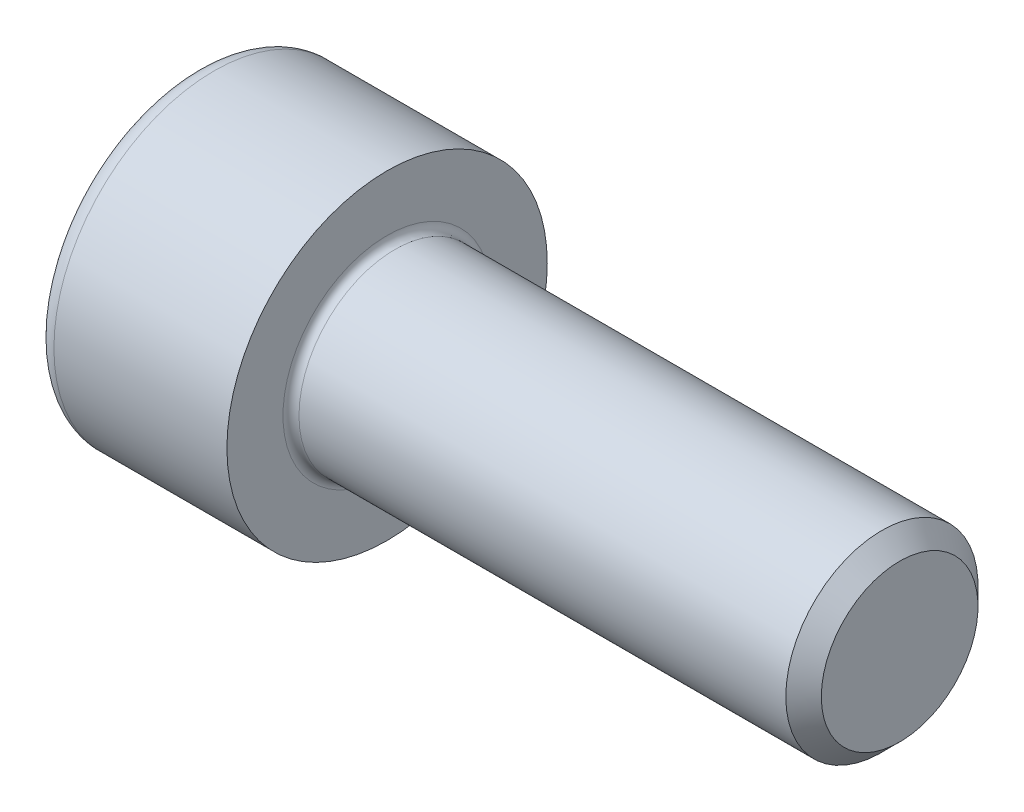
ISO-10303-21;
HEADER;
FILE_DESCRIPTION(('STEP AP214'),'2;1');
FILE_NAME('part.step','',(''),(''),'','','');
FILE_SCHEMA(('AUTOMOTIVE_DESIGN { 1 0 10303 214 1 1 1 1 }'));
ENDSEC;
DATA;
#1=APPLICATION_CONTEXT('core data for automotive mechanical design processes');
#2=APPLICATION_PROTOCOL_DEFINITION('international standard','automotive_design',2000,#1);
#3=PRODUCT_CONTEXT('',#1,'mechanical');
#4=PRODUCT('Part','Part','',(#3));
#5=PRODUCT_RELATED_PRODUCT_CATEGORY('part','',(#4));
#6=PRODUCT_DEFINITION_FORMATION('','',#4);
#7=PRODUCT_DEFINITION_CONTEXT('part definition',#1,'design');
#8=PRODUCT_DEFINITION('design','',#6,#7);
#9=PRODUCT_DEFINITION_SHAPE('','',#8);
#10=(LENGTH_UNIT() NAMED_UNIT(*) SI_UNIT(.MILLI.,.METRE.));
#11=(NAMED_UNIT(*) PLANE_ANGLE_UNIT() SI_UNIT($,.RADIAN.));
#12=(NAMED_UNIT(*) SI_UNIT($,.STERADIAN.) SOLID_ANGLE_UNIT());
#13=UNCERTAINTY_MEASURE_WITH_UNIT(LENGTH_MEASURE(1.E-05),#10,'distance_accuracy_value','');
#14=(GEOMETRIC_REPRESENTATION_CONTEXT(3) GLOBAL_UNCERTAINTY_ASSIGNED_CONTEXT((#13)) GLOBAL_UNIT_ASSIGNED_CONTEXT((#10,
#11,#12)) REPRESENTATION_CONTEXT('',''));
#15=CARTESIAN_POINT('',(0.,0.,0.));
#16=DIRECTION('',(0.,0.,1.));
#17=DIRECTION('',(1.,0.,0.));
#18=AXIS2_PLACEMENT_3D('',#15,#16,#17);
#19=CARTESIAN_POINT('',(3.,1.44337567297405,-2.5));
#20=DIRECTION('',(-1.,0.,0.));
#21=DIRECTION('',(0.,0.,1.));
#22=AXIS2_PLACEMENT_3D('',#19,#20,#21);
#23=PLANE('',#22);
#24=DIRECTION('',(0.,-1.,0.));
#25=VECTOR('',#24,1.);
#26=CARTESIAN_POINT('',(3.,1.44337567297405,2.5));
#27=LINE('',#26,#25);
#28=CARTESIAN_POINT('',(3.,0.,2.5));
#29=VERTEX_POINT('',#28);
#30=CARTESIAN_POINT('',(3.,-1.44337567297408,2.5));
#31=VERTEX_POINT('',#30);
#32=EDGE_CURVE('E167',#29,#31,#27,.T.);
#33=ORIENTED_EDGE('',*,*,#32,.F.);
#34=CARTESIAN_POINT('',(3.,0.,0.));
#35=DIRECTION('',(-1.,0.,0.));
#36=DIRECTION('',(0.,0.,1.));
#37=AXIS2_PLACEMENT_3D('',#34,#35,#36);
#38=CIRCLE('',#37,2.5);
#39=CARTESIAN_POINT('',(3.,-2.16506350946111,1.25000000000001));
#40=VERTEX_POINT('',#39);
#41=EDGE_CURVE('E49',#29,#40,#38,.F.);
#42=ORIENTED_EDGE('',*,*,#41,.T.);
#43=DIRECTION('',(0.,-0.5,-0.866025403784439));
#44=VECTOR('',#43,1.);
#45=CARTESIAN_POINT('',(3.,-1.44337567297408,2.5));
#46=LINE('',#45,#44);
#47=EDGE_CURVE('E173',#31,#40,#46,.T.);
#48=ORIENTED_EDGE('',*,*,#47,.F.);
#49=EDGE_LOOP('',(#33,#42,#48));
#50=FACE_BOUND('',#49,.T.);
#51=ADVANCED_FACE('F34',(#50),#23,.T.);
#52=CARTESIAN_POINT('',(3.,-2.88675134594815,0.));
#53=VERTEX_POINT('',#52);
#54=EDGE_CURVE('E172',#40,#53,#46,.T.);
#55=ORIENTED_EDGE('',*,*,#54,.F.);
#56=CARTESIAN_POINT('',(3.,-2.16506350946111,-1.25000000000001));
#57=VERTEX_POINT('',#56);
#58=EDGE_CURVE('E253',#40,#57,#38,.F.);
#59=ORIENTED_EDGE('',*,*,#58,.T.);
#60=DIRECTION('',(0.,0.5,-0.866025403784439));
#61=VECTOR('',#60,1.);
#62=CARTESIAN_POINT('',(3.,-2.88675134594815,0.));
#63=LINE('',#62,#61);
#64=EDGE_CURVE('E177',#53,#57,#63,.T.);
#65=ORIENTED_EDGE('',*,*,#64,.F.);
#66=EDGE_LOOP('',(#55,#59,#65));
#67=FACE_BOUND('',#66,.T.);
#68=ADVANCED_FACE('F124',(#67),#23,.T.);
#69=CARTESIAN_POINT('',(3.,-1.44337567297408,-2.5));
#70=VERTEX_POINT('',#69);
#71=EDGE_CURVE('E176',#57,#70,#63,.T.);
#72=ORIENTED_EDGE('',*,*,#71,.F.);
#73=CARTESIAN_POINT('',(3.,0.,-2.5));
#74=VERTEX_POINT('',#73);
#75=EDGE_CURVE('E249',#57,#74,#38,.F.);
#76=ORIENTED_EDGE('',*,*,#75,.T.);
#77=DIRECTION('',(0.,1.,0.));
#78=VECTOR('',#77,1.);
#79=CARTESIAN_POINT('',(3.,-1.44337567297408,-2.5));
#80=LINE('',#79,#78);
#81=EDGE_CURVE('E181',#70,#74,#80,.T.);
#82=ORIENTED_EDGE('',*,*,#81,.F.);
#83=EDGE_LOOP('',(#72,#76,#82));
#84=FACE_BOUND('',#83,.T.);
#85=ADVANCED_FACE('F130',(#84),#23,.T.);
#86=CARTESIAN_POINT('',(3.,1.44337567297405,-2.5));
#87=VERTEX_POINT('',#86);
#88=EDGE_CURVE('E180',#74,#87,#80,.T.);
#89=ORIENTED_EDGE('',*,*,#88,.F.);
#90=CARTESIAN_POINT('',(3.,2.16506350946108,-1.24999999999999));
#91=VERTEX_POINT('',#90);
#92=EDGE_CURVE('E248',#74,#91,#38,.F.);
#93=ORIENTED_EDGE('',*,*,#92,.T.);
#94=DIRECTION('',(0.,0.5,0.866025403784439));
#95=VECTOR('',#94,1.);
#96=CARTESIAN_POINT('',(3.,1.44337567297405,-2.5));
#97=LINE('',#96,#95);
#98=EDGE_CURVE('E157',#87,#91,#97,.T.);
#99=ORIENTED_EDGE('',*,*,#98,.F.);
#100=EDGE_LOOP('',(#89,#93,#99));
#101=FACE_BOUND('',#100,.T.);
#102=ADVANCED_FACE('F144',(#101),#23,.T.);
#103=CARTESIAN_POINT('',(3.,2.88675134594811,0.));
#104=VERTEX_POINT('',#103);
#105=EDGE_CURVE('E197',#91,#104,#97,.T.);
#106=ORIENTED_EDGE('',*,*,#105,.F.);
#107=CARTESIAN_POINT('',(3.,2.16506350946108,1.24999999999999));
#108=VERTEX_POINT('',#107);
#109=EDGE_CURVE('E222',#91,#108,#38,.F.);
#110=ORIENTED_EDGE('',*,*,#109,.T.);
#111=DIRECTION('',(0.,-0.5,0.866025403784439));
#112=VECTOR('',#111,1.);
#113=CARTESIAN_POINT('',(3.,2.88675134594811,0.));
#114=LINE('',#113,#112);
#115=EDGE_CURVE('E156',#104,#108,#114,.T.);
#116=ORIENTED_EDGE('',*,*,#115,.F.);
#117=EDGE_LOOP('',(#106,#110,#116));
#118=FACE_BOUND('',#117,.T.);
#119=ADVANCED_FACE('F135',(#118),#23,.T.);
#120=CARTESIAN_POINT('',(3.,1.44337567297405,2.5));
#121=VERTEX_POINT('',#120);
#122=EDGE_CURVE('E148',#108,#121,#114,.T.);
#123=ORIENTED_EDGE('',*,*,#122,.F.);
#124=EDGE_CURVE('E150',#108,#29,#38,.F.);
#125=ORIENTED_EDGE('',*,*,#124,.T.);
#126=EDGE_CURVE('E152',#121,#29,#27,.T.);
#127=ORIENTED_EDGE('',*,*,#126,.F.);
#128=EDGE_LOOP('',(#123,#125,#127));
#129=FACE_BOUND('',#128,.T.);
#130=ADVANCED_FACE('F126',(#129),#23,.T.);
#131=CARTESIAN_POINT('',(0.,0.,0.));
#132=DIRECTION('',(1.,0.,0.));
#133=DIRECTION('',(0.,0.,-1.));
#134=AXIS2_PLACEMENT_3D('',#131,#132,#133);
#135=PLANE('',#134);
#136=CARTESIAN_POINT('',(0.,0.,0.));
#137=DIRECTION('',(1.,0.,0.));
#138=DIRECTION('',(0.,0.,-1.));
#139=AXIS2_PLACEMENT_3D('',#136,#137,#138);
#140=CIRCLE('',#139,4.4);
#141=CARTESIAN_POINT('',(0.,0.,-4.4));
#142=VERTEX_POINT('',#141);
#143=EDGE_CURVE('E11',#142,#142,#140,.F.);
#144=ORIENTED_EDGE('',*,*,#143,.T.);
#145=EDGE_LOOP('',(#144));
#146=FACE_BOUND('',#145,.T.);
#147=DIRECTION('',(0.,0.5,0.866025403784439));
#148=VECTOR('',#147,1.);
#149=CARTESIAN_POINT('',(0.,1.44337567297405,-2.5));
#150=LINE('',#149,#148);
#151=CARTESIAN_POINT('',(0.,1.44337567297405,-2.5));
#152=VERTEX_POINT('',#151);
#153=CARTESIAN_POINT('',(0.,2.88675134594811,0.));
#154=VERTEX_POINT('',#153);
#155=EDGE_CURVE('E185',#152,#154,#150,.T.);
#156=ORIENTED_EDGE('',*,*,#155,.T.);
#157=DIRECTION('',(0.,-0.5,0.866025403784439));
#158=VECTOR('',#157,1.);
#159=CARTESIAN_POINT('',(0.,2.88675134594811,0.));
#160=LINE('',#159,#158);
#161=CARTESIAN_POINT('',(0.,1.44337567297405,2.5));
#162=VERTEX_POINT('',#161);
#163=EDGE_CURVE('E187',#154,#162,#160,.T.);
#164=ORIENTED_EDGE('',*,*,#163,.T.);
#165=DIRECTION('',(0.,-1.,0.));
#166=VECTOR('',#165,1.);
#167=CARTESIAN_POINT('',(0.,1.44337567297405,2.5));
#168=LINE('',#167,#166);
#169=CARTESIAN_POINT('',(0.,-1.44337567297408,2.5));
#170=VERTEX_POINT('',#169);
#171=EDGE_CURVE('E190',#162,#170,#168,.T.);
#172=ORIENTED_EDGE('',*,*,#171,.T.);
#173=DIRECTION('',(0.,-0.5,-0.866025403784439));
#174=VECTOR('',#173,1.);
#175=CARTESIAN_POINT('',(0.,-1.44337567297408,2.5));
#176=LINE('',#175,#174);
#177=CARTESIAN_POINT('',(0.,-2.88675134594815,0.));
#178=VERTEX_POINT('',#177);
#179=EDGE_CURVE('E192',#170,#178,#176,.T.);
#180=ORIENTED_EDGE('',*,*,#179,.T.);
#181=DIRECTION('',(0.,0.5,-0.866025403784439));
#182=VECTOR('',#181,1.);
#183=CARTESIAN_POINT('',(0.,-2.88675134594815,0.));
#184=LINE('',#183,#182);
#185=CARTESIAN_POINT('',(0.,-1.44337567297408,-2.5));
#186=VERTEX_POINT('',#185);
#187=EDGE_CURVE('E194',#178,#186,#184,.T.);
#188=ORIENTED_EDGE('',*,*,#187,.T.);
#189=DIRECTION('',(0.,1.,0.));
#190=VECTOR('',#189,1.);
#191=CARTESIAN_POINT('',(0.,-1.44337567297408,-2.5));
#192=LINE('',#191,#190);
#193=EDGE_CURVE('E57',#186,#152,#192,.T.);
#194=ORIENTED_EDGE('',*,*,#193,.T.);
#195=EDGE_LOOP('',(#156,#164,#172,#180,#188,#194));
#196=FACE_BOUND('',#195,.T.);
#197=ADVANCED_FACE('F134',(#146,#196),#135,.F.);
#198=CARTESIAN_POINT('',(6.,0.,0.));
#199=DIRECTION('',(1.,0.,0.));
#200=DIRECTION('',(0.,0.,-1.));
#201=AXIS2_PLACEMENT_3D('',#198,#199,#200);
#202=PLANE('',#201);
#203=CARTESIAN_POINT('',(6.,0.,0.));
#204=DIRECTION('',(1.,0.,0.));
#205=DIRECTION('',(0.,0.,-1.));
#206=AXIS2_PLACEMENT_3D('',#203,#204,#205);
#207=CIRCLE('',#206,3.25);
#208=CARTESIAN_POINT('',(6.,0.,-3.25));
#209=VERTEX_POINT('',#208);
#210=EDGE_CURVE('E223',#209,#209,#207,.F.);
#211=ORIENTED_EDGE('',*,*,#210,.T.);
#212=EDGE_LOOP('',(#211));
#213=FACE_BOUND('',#212,.T.);
#214=CARTESIAN_POINT('',(6.,0.,0.));
#215=DIRECTION('',(1.,0.,0.));
#216=DIRECTION('',(0.,0.,-1.));
#217=AXIS2_PLACEMENT_3D('',#214,#215,#216);
#218=CIRCLE('',#217,5.);
#219=CARTESIAN_POINT('',(6.,0.,-5.));
#220=VERTEX_POINT('',#219);
#221=EDGE_CURVE('E218',#220,#220,#218,.T.);
#222=ORIENTED_EDGE('',*,*,#221,.T.);
#223=EDGE_LOOP('',(#222));
#224=FACE_BOUND('',#223,.T.);
#225=ADVANCED_FACE('F141',(#213,#224),#202,.T.);
#226=CARTESIAN_POINT('',(6.,0.,0.));
#227=DIRECTION('',(-1.,0.,0.));
#228=DIRECTION('',(0.,0.,1.));
#229=AXIS2_PLACEMENT_3D('',#226,#227,#228);
#230=CYLINDRICAL_SURFACE('',#229,5.);
#231=CARTESIAN_POINT('',(0.6,0.,0.));
#232=DIRECTION('',(1.,0.,0.));
#233=DIRECTION('',(0.,0.,-1.));
#234=AXIS2_PLACEMENT_3D('',#231,#232,#233);
#235=CIRCLE('',#234,5.);
#236=CARTESIAN_POINT('',(0.6,0.,-5.));
#237=VERTEX_POINT('',#236);
#238=EDGE_CURVE('E42',#237,#237,#235,.T.);
#239=ORIENTED_EDGE('',*,*,#238,.T.);
#240=EDGE_LOOP('',(#239));
#241=FACE_BOUND('',#240,.T.);
#242=ORIENTED_EDGE('',*,*,#221,.F.);
#243=EDGE_LOOP('',(#242));
#244=FACE_BOUND('',#243,.T.);
#245=ADVANCED_FACE('F231',(#241,#244),#230,.T.);
#246=CARTESIAN_POINT('',(22.,0.,0.));
#247=DIRECTION('',(-1.,0.,0.));
#248=DIRECTION('',(0.,0.,1.));
#249=AXIS2_PLACEMENT_3D('',#246,#247,#248);
#250=PLANE('',#249);
#251=CARTESIAN_POINT('',(22.,0.,0.));
#252=DIRECTION('',(-1.,0.,0.));
#253=DIRECTION('',(0.,0.,1.));
#254=AXIS2_PLACEMENT_3D('',#251,#252,#253);
#255=CIRCLE('',#254,2.4455);
#256=CARTESIAN_POINT('',(22.,0.,2.4455));
#257=VERTEX_POINT('',#256);
#258=EDGE_CURVE('E215',#257,#257,#255,.T.);
#259=ORIENTED_EDGE('',*,*,#258,.F.);
#260=EDGE_LOOP('',(#259));
#261=FACE_BOUND('',#260,.T.);
#262=ADVANCED_FACE('F387',(#261),#250,.F.);
#263=CARTESIAN_POINT('',(22.,0.,0.));
#264=DIRECTION('',(-1.,0.,0.));
#265=DIRECTION('',(0.,0.,1.));
#266=AXIS2_PLACEMENT_3D('',#263,#264,#265);
#267=CONICAL_SURFACE('',#266,2.4455,0.785398163397445);
#268=CARTESIAN_POINT('',(21.4455,0.,0.));
#269=DIRECTION('',(-1.,0.,0.));
#270=DIRECTION('',(0.,0.,1.));
#271=AXIS2_PLACEMENT_3D('',#268,#269,#270);
#272=CIRCLE('',#271,3.);
#273=CARTESIAN_POINT('',(21.4455,0.,3.));
#274=VERTEX_POINT('',#273);
#275=EDGE_CURVE('E212',#274,#274,#272,.T.);
#276=ORIENTED_EDGE('',*,*,#275,.F.);
#277=EDGE_LOOP('',(#276));
#278=FACE_BOUND('',#277,.T.);
#279=ORIENTED_EDGE('',*,*,#258,.T.);
#280=EDGE_LOOP('',(#279));
#281=FACE_BOUND('',#280,.T.);
#282=ADVANCED_FACE('F367',(#278,#281),#267,.T.);
#283=CARTESIAN_POINT('',(0.,0.,0.));
#284=DIRECTION('',(-1.,0.,0.));
#285=DIRECTION('',(0.,0.,1.));
#286=AXIS2_PLACEMENT_3D('',#283,#284,#285);
#287=CYLINDRICAL_SURFACE('',#286,3.);
#288=CARTESIAN_POINT('',(6.25,0.,0.));
#289=DIRECTION('',(1.,0.,0.));
#290=DIRECTION('',(0.,0.,-1.));
#291=AXIS2_PLACEMENT_3D('',#288,#289,#290);
#292=CIRCLE('',#291,3.);
#293=CARTESIAN_POINT('',(6.25,0.,-3.));
#294=VERTEX_POINT('',#293);
#295=EDGE_CURVE('E226',#294,#294,#292,.T.);
#296=ORIENTED_EDGE('',*,*,#295,.T.);
#297=EDGE_LOOP('',(#296));
#298=FACE_BOUND('',#297,.T.);
#299=ORIENTED_EDGE('',*,*,#275,.T.);
#300=EDGE_LOOP('',(#299));
#301=FACE_BOUND('',#300,.T.);
#302=ADVANCED_FACE('F295',(#298,#301),#287,.T.);
#303=CARTESIAN_POINT('',(3.,1.44337567297405,-2.5));
#304=DIRECTION('',(0.,-0.866025403784439,0.5));
#305=DIRECTION('',(0.,-0.5,-0.866025403784439));
#306=AXIS2_PLACEMENT_3D('',#303,#304,#305);
#307=PLANE('',#306);
#308=ORIENTED_EDGE('',*,*,#98,.T.);
#309=ORIENTED_EDGE('',*,*,#105,.T.);
#310=DIRECTION('',(-1.,0.,0.));
#311=VECTOR('',#310,1.);
#312=CARTESIAN_POINT('',(3.,2.88675134594811,0.));
#313=LINE('',#312,#311);
#314=EDGE_CURVE('E164',#104,#154,#313,.T.);
#315=ORIENTED_EDGE('',*,*,#314,.T.);
#316=ORIENTED_EDGE('',*,*,#155,.F.);
#317=DIRECTION('',(-1.,0.,0.));
#318=VECTOR('',#317,1.);
#319=CARTESIAN_POINT('',(3.,1.44337567297405,-2.5));
#320=LINE('',#319,#318);
#321=EDGE_CURVE('E184',#87,#152,#320,.T.);
#322=ORIENTED_EDGE('',*,*,#321,.F.);
#323=EDGE_LOOP('',(#308,#309,#315,#316,#322));
#324=FACE_BOUND('',#323,.T.);
#325=ADVANCED_FACE('F245',(#324),#307,.T.);
#326=CARTESIAN_POINT('',(3.,2.88675134594811,0.));
#327=DIRECTION('',(0.,-0.866025403784439,-0.5));
#328=DIRECTION('',(0.,0.5,-0.866025403784439));
#329=AXIS2_PLACEMENT_3D('',#326,#327,#328);
#330=PLANE('',#329);
#331=ORIENTED_EDGE('',*,*,#115,.T.);
#332=ORIENTED_EDGE('',*,*,#122,.T.);
#333=DIRECTION('',(-1.,0.,0.));
#334=VECTOR('',#333,1.);
#335=CARTESIAN_POINT('',(3.,1.44337567297405,2.5));
#336=LINE('',#335,#334);
#337=EDGE_CURVE('E209',#121,#162,#336,.T.);
#338=ORIENTED_EDGE('',*,*,#337,.T.);
#339=ORIENTED_EDGE('',*,*,#163,.F.);
#340=ORIENTED_EDGE('',*,*,#314,.F.);
#341=EDGE_LOOP('',(#331,#332,#338,#339,#340));
#342=FACE_BOUND('',#341,.T.);
#343=ADVANCED_FACE('F161',(#342),#330,.T.);
#344=CARTESIAN_POINT('',(3.,1.44337567297405,2.5));
#345=DIRECTION('',(0.,0.,-1.));
#346=DIRECTION('',(0.,1.,0.));
#347=AXIS2_PLACEMENT_3D('',#344,#345,#346);
#348=PLANE('',#347);
#349=ORIENTED_EDGE('',*,*,#126,.T.);
#350=ORIENTED_EDGE('',*,*,#32,.T.);
#351=DIRECTION('',(-1.,0.,0.));
#352=VECTOR('',#351,1.);
#353=CARTESIAN_POINT('',(3.,-1.44337567297408,2.5));
#354=LINE('',#353,#352);
#355=EDGE_CURVE('E206',#31,#170,#354,.T.);
#356=ORIENTED_EDGE('',*,*,#355,.T.);
#357=ORIENTED_EDGE('',*,*,#171,.F.);
#358=ORIENTED_EDGE('',*,*,#337,.F.);
#359=EDGE_LOOP('',(#349,#350,#356,#357,#358));
#360=FACE_BOUND('',#359,.T.);
#361=ADVANCED_FACE('F267',(#360),#348,.T.);
#362=CARTESIAN_POINT('',(3.,-1.44337567297408,2.5));
#363=DIRECTION('',(0.,0.866025403784438,-0.5));
#364=DIRECTION('',(0.,0.5,0.866025403784439));
#365=AXIS2_PLACEMENT_3D('',#362,#363,#364);
#366=PLANE('',#365);
#367=ORIENTED_EDGE('',*,*,#47,.T.);
#368=ORIENTED_EDGE('',*,*,#54,.T.);
#369=DIRECTION('',(-1.,0.,0.));
#370=VECTOR('',#369,1.);
#371=CARTESIAN_POINT('',(3.,-2.88675134594815,0.));
#372=LINE('',#371,#370);
#373=EDGE_CURVE('E203',#53,#178,#372,.T.);
#374=ORIENTED_EDGE('',*,*,#373,.T.);
#375=ORIENTED_EDGE('',*,*,#179,.F.);
#376=ORIENTED_EDGE('',*,*,#355,.F.);
#377=EDGE_LOOP('',(#367,#368,#374,#375,#376));
#378=FACE_BOUND('',#377,.T.);
#379=ADVANCED_FACE('F264',(#378),#366,.T.);
#380=CARTESIAN_POINT('',(3.,-2.88675134594815,0.));
#381=DIRECTION('',(0.,0.866025403784439,0.5));
#382=DIRECTION('',(0.,-0.5,0.866025403784439));
#383=AXIS2_PLACEMENT_3D('',#380,#381,#382);
#384=PLANE('',#383);
#385=ORIENTED_EDGE('',*,*,#64,.T.);
#386=ORIENTED_EDGE('',*,*,#71,.T.);
#387=DIRECTION('',(-1.,0.,0.));
#388=VECTOR('',#387,1.);
#389=CARTESIAN_POINT('',(3.,-1.44337567297408,-2.5));
#390=LINE('',#389,#388);
#391=EDGE_CURVE('E200',#70,#186,#390,.T.);
#392=ORIENTED_EDGE('',*,*,#391,.T.);
#393=ORIENTED_EDGE('',*,*,#187,.F.);
#394=ORIENTED_EDGE('',*,*,#373,.F.);
#395=EDGE_LOOP('',(#385,#386,#392,#393,#394));
#396=FACE_BOUND('',#395,.T.);
#397=ADVANCED_FACE('F118',(#396),#384,.T.);
#398=CARTESIAN_POINT('',(3.,-1.44337567297408,-2.5));
#399=DIRECTION('',(0.,0.,1.));
#400=DIRECTION('',(1.,0.,0.));
#401=AXIS2_PLACEMENT_3D('',#398,#399,#400);
#402=PLANE('',#401);
#403=ORIENTED_EDGE('',*,*,#81,.T.);
#404=ORIENTED_EDGE('',*,*,#88,.T.);
#405=ORIENTED_EDGE('',*,*,#321,.T.);
#406=ORIENTED_EDGE('',*,*,#193,.F.);
#407=ORIENTED_EDGE('',*,*,#391,.F.);
#408=EDGE_LOOP('',(#403,#404,#405,#406,#407));
#409=FACE_BOUND('',#408,.T.);
#410=ADVANCED_FACE('F109',(#409),#402,.T.);
#411=CARTESIAN_POINT('',(5.14337567297408,0.,0.));
#412=DIRECTION('',(-1.,0.,0.));
#413=DIRECTION('',(0.,0.,1.));
#414=AXIS2_PLACEMENT_3D('',#411,#412,#413);
#415=CONICAL_SURFACE('',#414,0.,1.04719755119659);
#416=CARTESIAN_POINT('',(3.7,0.,0.));
#417=DIRECTION('',(-1.,0.,0.));
#418=DIRECTION('',(0.,0.,1.));
#419=AXIS2_PLACEMENT_3D('',#416,#417,#418);
#420=CIRCLE('',#419,2.5);
#421=CARTESIAN_POINT('',(3.7,0.,2.5));
#422=VERTEX_POINT('',#421);
#423=EDGE_CURVE('E188',#422,#422,#420,.T.);
#424=ORIENTED_EDGE('',*,*,#423,.T.);
#425=EDGE_LOOP('',(#424));
#426=FACE_BOUND('',#425,.T.);
#427=CARTESIAN_POINT('',(5.14337567297408,0.,0.));
#428=VERTEX_POINT('',#427);
#429=VERTEX_LOOP('',#428);
#430=FACE_BOUND('',#429,.T.);
#431=ADVANCED_FACE('F106',(#426,#430),#415,.F.);
#432=CARTESIAN_POINT('',(0.,0.,0.));
#433=DIRECTION('',(-1.,0.,0.));
#434=DIRECTION('',(0.,0.,1.));
#435=AXIS2_PLACEMENT_3D('',#432,#433,#434);
#436=CYLINDRICAL_SURFACE('',#435,2.5);
#437=ORIENTED_EDGE('',*,*,#124,.F.);
#438=ORIENTED_EDGE('',*,*,#109,.F.);
#439=ORIENTED_EDGE('',*,*,#92,.F.);
#440=ORIENTED_EDGE('',*,*,#75,.F.);
#441=ORIENTED_EDGE('',*,*,#58,.F.);
#442=ORIENTED_EDGE('',*,*,#41,.F.);
#443=EDGE_LOOP('',(#437,#438,#439,#440,#441,#442));
#444=FACE_BOUND('',#443,.T.);
#445=ORIENTED_EDGE('',*,*,#423,.F.);
#446=EDGE_LOOP('',(#445));
#447=FACE_BOUND('',#446,.T.);
#448=ADVANCED_FACE('F108',(#444,#447),#436,.F.);
#449=CARTESIAN_POINT('',(6.25,0.,0.));
#450=DIRECTION('',(1.,0.,0.));
#451=DIRECTION('',(0.,0.,-1.));
#452=AXIS2_PLACEMENT_3D('',#449,#450,#451);
#453=TOROIDAL_SURFACE('',#452,3.25,0.25);
#454=ORIENTED_EDGE('',*,*,#295,.F.);
#455=EDGE_LOOP('',(#454));
#456=FACE_BOUND('',#455,.T.);
#457=ORIENTED_EDGE('',*,*,#210,.F.);
#458=EDGE_LOOP('',(#457));
#459=FACE_BOUND('',#458,.T.);
#460=ADVANCED_FACE('F116',(#456,#459),#453,.F.);
#461=CARTESIAN_POINT('',(0.6,0.,0.));
#462=DIRECTION('',(1.,0.,0.));
#463=DIRECTION('',(0.,0.,-1.));
#464=AXIS2_PLACEMENT_3D('',#461,#462,#463);
#465=TOROIDAL_SURFACE('',#464,4.4,0.6);
#466=ORIENTED_EDGE('',*,*,#143,.F.);
#467=EDGE_LOOP('',(#466));
#468=FACE_BOUND('',#467,.T.);
#469=ORIENTED_EDGE('',*,*,#238,.F.);
#470=EDGE_LOOP('',(#469));
#471=FACE_BOUND('',#470,.T.);
#472=ADVANCED_FACE('F36',(#468,#471),#465,.T.);
#473=CLOSED_SHELL('',(#51,#68,#85,#102,#119,#130,#197,#225,#245,#262,#282,#302,#325,#343,#361,
#379,#397,#410,#431,#448,#460,#472));
#474=MANIFOLD_SOLID_BREP('B2',#473);
#475=ADVANCED_BREP_SHAPE_REPRESENTATION('',(#18,#474),#14);
#476=SHAPE_DEFINITION_REPRESENTATION(#9,#475);
ENDSEC;
END-ISO-10303-21;
